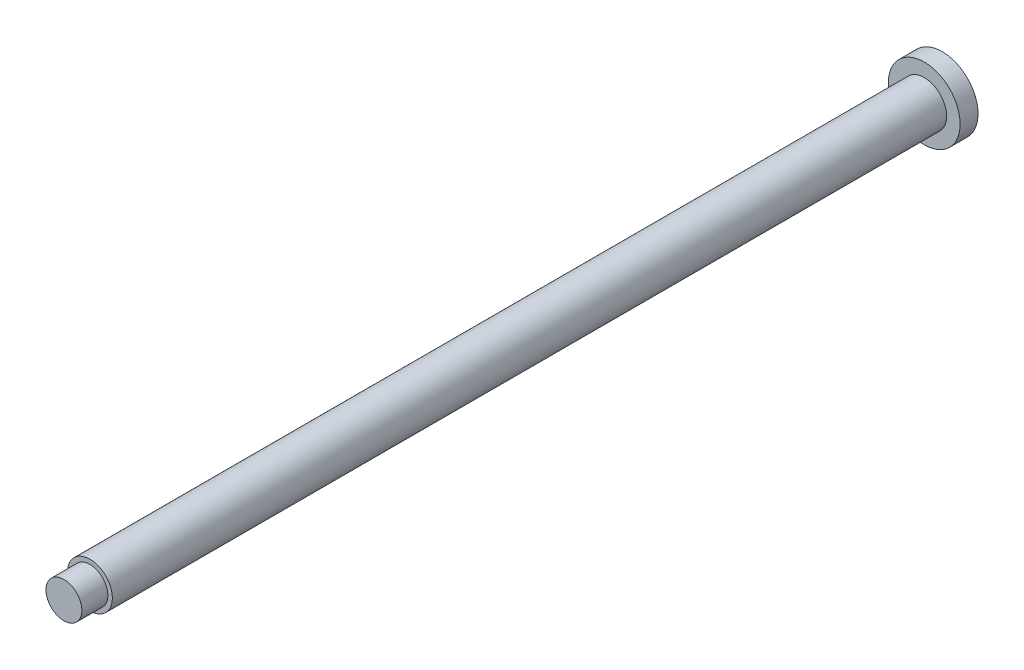
ISO-10303-21;
HEADER;
FILE_DESCRIPTION(('STEP AP214'),'2;1');
FILE_NAME('part.step','',(''),(''),'','','');
FILE_SCHEMA(('AUTOMOTIVE_DESIGN { 1 0 10303 214 1 1 1 1 }'));
ENDSEC;
DATA;
#1=APPLICATION_CONTEXT('core data for automotive mechanical design processes');
#2=APPLICATION_PROTOCOL_DEFINITION('international standard','automotive_design',2000,#1);
#3=PRODUCT_CONTEXT('',#1,'mechanical');
#4=PRODUCT('Part','Part','',(#3));
#5=PRODUCT_RELATED_PRODUCT_CATEGORY('part','',(#4));
#6=PRODUCT_DEFINITION_FORMATION('','',#4);
#7=PRODUCT_DEFINITION_CONTEXT('part definition',#1,'design');
#8=PRODUCT_DEFINITION('design','',#6,#7);
#9=PRODUCT_DEFINITION_SHAPE('','',#8);
#10=(LENGTH_UNIT() NAMED_UNIT(*) SI_UNIT(.MILLI.,.METRE.));
#11=(NAMED_UNIT(*) PLANE_ANGLE_UNIT() SI_UNIT($,.RADIAN.));
#12=(NAMED_UNIT(*) SI_UNIT($,.STERADIAN.) SOLID_ANGLE_UNIT());
#13=UNCERTAINTY_MEASURE_WITH_UNIT(LENGTH_MEASURE(1.E-05),#10,'distance_accuracy_value','');
#14=(GEOMETRIC_REPRESENTATION_CONTEXT(3) GLOBAL_UNCERTAINTY_ASSIGNED_CONTEXT((#13)) GLOBAL_UNIT_ASSIGNED_CONTEXT((#10,
#11,#12)) REPRESENTATION_CONTEXT('',''));
#15=CARTESIAN_POINT('',(0.,0.,0.));
#16=DIRECTION('',(0.,0.,1.));
#17=DIRECTION('',(1.,0.,0.));
#18=AXIS2_PLACEMENT_3D('',#15,#16,#17);
#19=CARTESIAN_POINT('',(0.,0.,93.));
#20=DIRECTION('',(0.,0.,-1.));
#21=DIRECTION('',(-1.,0.,0.));
#22=AXIS2_PLACEMENT_3D('',#19,#20,#21);
#23=CYLINDRICAL_SURFACE('',#22,2.5);
#24=CARTESIAN_POINT('',(0.,0.,93.));
#25=DIRECTION('',(0.,0.,1.));
#26=DIRECTION('',(1.,0.,0.));
#27=AXIS2_PLACEMENT_3D('',#24,#25,#26);
#28=CIRCLE('',#27,2.5);
#29=CARTESIAN_POINT('',(-2.5,0.,93.));
#30=VERTEX_POINT('',#29);
#31=EDGE_CURVE('E55',#30,#30,#28,.T.);
#32=CARTESIAN_POINT('',(0.,0.,0.));
#33=DIRECTION('',(0.,0.,1.));
#34=DIRECTION('',(1.,0.,0.));
#35=AXIS2_PLACEMENT_3D('',#32,#33,#34);
#36=CIRCLE('',#35,2.5);
#37=CARTESIAN_POINT('',(-2.5,0.,0.));
#38=VERTEX_POINT('',#37);
#39=EDGE_CURVE('E50',#38,#38,#36,.T.);
#40=CARTESIAN_POINT('',(-2.5,0.,93.));
#41=CARTESIAN_POINT('',(-2.5,0.,92.03125));
#42=CARTESIAN_POINT('',(-2.5,0.,91.0625));
#43=CARTESIAN_POINT('',(-2.5,0.,89.125));
#44=CARTESIAN_POINT('',(-2.5,0.,88.15625));
#45=CARTESIAN_POINT('',(-2.5,0.,86.21875));
#46=CARTESIAN_POINT('',(-2.5,0.,85.25));
#47=CARTESIAN_POINT('',(-2.5,0.,83.3125));
#48=CARTESIAN_POINT('',(-2.5,0.,82.34375));
#49=CARTESIAN_POINT('',(-2.5,0.,80.40625));
#50=CARTESIAN_POINT('',(-2.5,0.,79.4375));
#51=CARTESIAN_POINT('',(-2.5,0.,77.5));
#52=CARTESIAN_POINT('',(-2.5,0.,76.53125));
#53=CARTESIAN_POINT('',(-2.5,0.,74.59375));
#54=CARTESIAN_POINT('',(-2.5,0.,73.625));
#55=CARTESIAN_POINT('',(-2.5,0.,71.6875));
#56=CARTESIAN_POINT('',(-2.5,0.,70.71875));
#57=CARTESIAN_POINT('',(-2.5,0.,68.78125));
#58=CARTESIAN_POINT('',(-2.5,0.,67.8125));
#59=CARTESIAN_POINT('',(-2.5,0.,65.875));
#60=CARTESIAN_POINT('',(-2.5,0.,64.90625));
#61=CARTESIAN_POINT('',(-2.5,0.,62.96875));
#62=CARTESIAN_POINT('',(-2.5,0.,62.));
#63=CARTESIAN_POINT('',(-2.5,0.,60.0625));
#64=CARTESIAN_POINT('',(-2.5,0.,59.09375));
#65=CARTESIAN_POINT('',(-2.5,0.,57.15625));
#66=CARTESIAN_POINT('',(-2.5,0.,56.1875));
#67=CARTESIAN_POINT('',(-2.5,0.,54.25));
#68=CARTESIAN_POINT('',(-2.5,0.,53.28125));
#69=CARTESIAN_POINT('',(-2.5,0.,51.34375));
#70=CARTESIAN_POINT('',(-2.5,0.,50.375));
#71=CARTESIAN_POINT('',(-2.5,0.,48.4375));
#72=CARTESIAN_POINT('',(-2.5,0.,47.46875));
#73=CARTESIAN_POINT('',(-2.5,0.,45.53125));
#74=CARTESIAN_POINT('',(-2.5,0.,44.5625));
#75=CARTESIAN_POINT('',(-2.5,0.,42.625));
#76=CARTESIAN_POINT('',(-2.5,0.,41.65625));
#77=CARTESIAN_POINT('',(-2.5,0.,39.71875));
#78=CARTESIAN_POINT('',(-2.5,0.,38.75));
#79=CARTESIAN_POINT('',(-2.5,0.,36.8125));
#80=CARTESIAN_POINT('',(-2.5,0.,35.84375));
#81=CARTESIAN_POINT('',(-2.5,0.,33.90625));
#82=CARTESIAN_POINT('',(-2.5,0.,32.9375));
#83=CARTESIAN_POINT('',(-2.5,0.,31.));
#84=CARTESIAN_POINT('',(-2.5,0.,30.03125));
#85=CARTESIAN_POINT('',(-2.5,0.,28.09375));
#86=CARTESIAN_POINT('',(-2.5,0.,27.125));
#87=CARTESIAN_POINT('',(-2.5,0.,25.1875));
#88=CARTESIAN_POINT('',(-2.5,0.,24.21875));
#89=CARTESIAN_POINT('',(-2.5,0.,22.28125));
#90=CARTESIAN_POINT('',(-2.5,0.,21.3125));
#91=CARTESIAN_POINT('',(-2.5,0.,19.375));
#92=CARTESIAN_POINT('',(-2.5,0.,18.40625));
#93=CARTESIAN_POINT('',(-2.5,0.,16.46875));
#94=CARTESIAN_POINT('',(-2.5,0.,15.5));
#95=CARTESIAN_POINT('',(-2.5,0.,13.5625));
#96=CARTESIAN_POINT('',(-2.5,0.,12.59375));
#97=CARTESIAN_POINT('',(-2.5,0.,10.65625));
#98=CARTESIAN_POINT('',(-2.5,0.,9.68749999999998));
#99=CARTESIAN_POINT('',(-2.5,0.,7.74999999999998));
#100=CARTESIAN_POINT('',(-2.5,0.,6.78124999999998));
#101=CARTESIAN_POINT('',(-2.5,0.,4.84374999999998));
#102=CARTESIAN_POINT('',(-2.5,0.,3.87499999999999));
#103=CARTESIAN_POINT('',(-2.5,0.,1.93749999999999));
#104=CARTESIAN_POINT('',(-2.5,0.,0.968749999999985));
#105=CARTESIAN_POINT('',(-2.5,0.,0.));
#106=B_SPLINE_CURVE_WITH_KNOTS('',3,(#40,#41,#42,#43,#44,#45,#46,#47,#48,#49,#50,#51,#52,#53,
#54,#55,#56,#57,#58,#59,#60,#61,#62,#63,#64,#65,#66,#67,#68,#69,#70,#71,#72,#73,#74,#75,#76,#77,
#78,#79,#80,#81,#82,#83,#84,#85,#86,#87,#88,#89,#90,#91,#92,#93,#94,#95,#96,#97,#98,#99,#100,
#101,#102,#103,#104,#105),.UNSPECIFIED.,.F.,.F.,(4,2,2,2,2,2,2,2,2,2,2,2,2,2,2,2,2,2,2,2,2,2,2,
2,2,2,2,2,2,2,2,2,4),(0.,2.90625000000001,5.81250000000001,8.71875000000001,11.625,14.53125,
17.4375,20.34375,23.25,26.15625,29.0625,31.96875,34.875,37.78125,40.6875,43.59375,46.5,49.40625,
52.3125,55.21875,58.125,61.03125,63.9375,66.84375,69.75,72.65625,75.5625,78.46875,81.375,
84.28125,87.1875,90.09375,93.),.UNSPECIFIED.);
#107=EDGE_CURVE('BSEAM47',#30,#38,#106,.T.);
#108=ORIENTED_EDGE('',*,*,#31,.F.);
#109=ORIENTED_EDGE('',*,*,#39,.T.);
#110=ORIENTED_EDGE('',*,*,#107,.T.);
#111=ORIENTED_EDGE('',*,*,#107,.F.);
#112=EDGE_LOOP('',(#108,#110,#109,#111));
#113=FACE_BOUND('',#112,.T.);
#114=ADVANCED_FACE('F47',(#113),#23,.T.);
#115=CARTESIAN_POINT('',(0.,0.,93.));
#116=DIRECTION('',(0.,0.,1.));
#117=DIRECTION('',(1.,0.,0.));
#118=AXIS2_PLACEMENT_3D('',#115,#116,#117);
#119=PLANE('',#118);
#120=CARTESIAN_POINT('',(0.,0.,93.));
#121=DIRECTION('',(0.,0.,1.));
#122=DIRECTION('',(1.,0.,0.));
#123=AXIS2_PLACEMENT_3D('',#120,#121,#122);
#124=CIRCLE('',#123,2.);
#125=CARTESIAN_POINT('',(2.,0.,93.));
#126=VERTEX_POINT('',#125);
#127=EDGE_CURVE('E10',#126,#126,#124,.T.);
#128=ORIENTED_EDGE('',*,*,#127,.F.);
#129=EDGE_LOOP('',(#128));
#130=FACE_BOUND('',#129,.T.);
#131=ORIENTED_EDGE('',*,*,#31,.T.);
#132=EDGE_LOOP('',(#131));
#133=FACE_BOUND('',#132,.T.);
#134=ADVANCED_FACE('F102',(#130,#133),#119,.T.);
#135=CARTESIAN_POINT('',(0.,0.,-2.));
#136=DIRECTION('',(0.,0.,1.));
#137=DIRECTION('',(1.,0.,0.));
#138=AXIS2_PLACEMENT_3D('',#135,#136,#137);
#139=CYLINDRICAL_SURFACE('',#138,4.);
#140=CARTESIAN_POINT('',(0.,0.,-2.));
#141=DIRECTION('',(0.,0.,-1.));
#142=DIRECTION('',(-1.,0.,0.));
#143=AXIS2_PLACEMENT_3D('',#140,#141,#142);
#144=CIRCLE('',#143,4.);
#145=CARTESIAN_POINT('',(-4.,0.,-2.));
#146=VERTEX_POINT('',#145);
#147=EDGE_CURVE('E73',#146,#146,#144,.T.);
#148=ORIENTED_EDGE('',*,*,#147,.F.);
#149=EDGE_LOOP('',(#148));
#150=FACE_BOUND('',#149,.T.);
#151=CARTESIAN_POINT('',(0.,0.,0.));
#152=DIRECTION('',(0.,0.,-1.));
#153=DIRECTION('',(-1.,0.,0.));
#154=AXIS2_PLACEMENT_3D('',#151,#152,#153);
#155=CIRCLE('',#154,4.);
#156=CARTESIAN_POINT('',(-4.,0.,0.));
#157=VERTEX_POINT('',#156);
#158=EDGE_CURVE('E68',#157,#157,#155,.T.);
#159=ORIENTED_EDGE('',*,*,#158,.T.);
#160=EDGE_LOOP('',(#159));
#161=FACE_BOUND('',#160,.T.);
#162=ADVANCED_FACE('F81',(#150,#161),#139,.T.);
#163=CARTESIAN_POINT('',(0.,0.,-2.));
#164=DIRECTION('',(0.,0.,-1.));
#165=DIRECTION('',(-1.,0.,0.));
#166=AXIS2_PLACEMENT_3D('',#163,#164,#165);
#167=PLANE('',#166);
#168=CARTESIAN_POINT('',(0.,0.,-2.));
#169=DIRECTION('',(0.,0.,-1.));
#170=DIRECTION('',(-1.,0.,0.));
#171=AXIS2_PLACEMENT_3D('',#168,#169,#170);
#172=CIRCLE('',#171,2.05);
#173=CARTESIAN_POINT('',(-2.05,0.,-2.));
#174=VERTEX_POINT('',#173);
#175=EDGE_CURVE('E69',#174,#174,#172,.T.);
#176=ORIENTED_EDGE('',*,*,#175,.F.);
#177=EDGE_LOOP('',(#176));
#178=FACE_BOUND('',#177,.T.);
#179=ORIENTED_EDGE('',*,*,#147,.T.);
#180=EDGE_LOOP('',(#179));
#181=FACE_BOUND('',#180,.T.);
#182=ADVANCED_FACE('F86',(#178,#181),#167,.T.);
#183=CARTESIAN_POINT('',(0.,0.,0.));
#184=DIRECTION('',(0.,0.,-1.));
#185=DIRECTION('',(-1.,0.,0.));
#186=AXIS2_PLACEMENT_3D('',#183,#184,#185);
#187=PLANE('',#186);
#188=ORIENTED_EDGE('',*,*,#39,.F.);
#189=EDGE_LOOP('',(#188));
#190=FACE_BOUND('',#189,.T.);
#191=ORIENTED_EDGE('',*,*,#158,.F.);
#192=EDGE_LOOP('',(#191));
#193=FACE_BOUND('',#192,.T.);
#194=ADVANCED_FACE('F83',(#190,#193),#187,.F.);
#195=CARTESIAN_POINT('',(0.,0.,1.));
#196=DIRECTION('',(0.,0.,-1.));
#197=DIRECTION('',(-1.,0.,0.));
#198=AXIS2_PLACEMENT_3D('',#195,#196,#197);
#199=CYLINDRICAL_SURFACE('',#198,2.05);
#200=CARTESIAN_POINT('',(0.,0.,1.));
#201=DIRECTION('',(0.,0.,-1.));
#202=DIRECTION('',(-1.,0.,0.));
#203=AXIS2_PLACEMENT_3D('',#200,#201,#202);
#204=CIRCLE('',#203,2.05);
#205=CARTESIAN_POINT('',(-2.05,0.,1.));
#206=VERTEX_POINT('',#205);
#207=EDGE_CURVE('E64',#206,#206,#204,.T.);
#208=ORIENTED_EDGE('',*,*,#207,.F.);
#209=EDGE_LOOP('',(#208));
#210=FACE_BOUND('',#209,.T.);
#211=ORIENTED_EDGE('',*,*,#175,.T.);
#212=EDGE_LOOP('',(#211));
#213=FACE_BOUND('',#212,.T.);
#214=ADVANCED_FACE('F85',(#210,#213),#199,.F.);
#215=CARTESIAN_POINT('',(0.,0.,1.));
#216=DIRECTION('',(0.,0.,-1.));
#217=DIRECTION('',(-1.,0.,0.));
#218=AXIS2_PLACEMENT_3D('',#215,#216,#217);
#219=PLANE('',#218);
#220=ORIENTED_EDGE('',*,*,#207,.T.);
#221=EDGE_LOOP('',(#220));
#222=FACE_BOUND('',#221,.T.);
#223=ADVANCED_FACE('F94',(#222),#219,.T.);
#224=CARTESIAN_POINT('',(0.,0.,95.9));
#225=DIRECTION('',(0.,0.,-1.));
#226=DIRECTION('',(-1.,0.,0.));
#227=AXIS2_PLACEMENT_3D('',#224,#225,#226);
#228=CYLINDRICAL_SURFACE('',#227,2.);
#229=CARTESIAN_POINT('',(0.,0.,95.9));
#230=DIRECTION('',(0.,0.,1.));
#231=DIRECTION('',(1.,0.,0.));
#232=AXIS2_PLACEMENT_3D('',#229,#230,#231);
#233=CIRCLE('',#232,2.);
#234=CARTESIAN_POINT('',(2.,0.,95.9));
#235=VERTEX_POINT('',#234);
#236=EDGE_CURVE('E63',#235,#235,#233,.T.);
#237=ORIENTED_EDGE('',*,*,#236,.F.);
#238=EDGE_LOOP('',(#237));
#239=FACE_BOUND('',#238,.T.);
#240=ORIENTED_EDGE('',*,*,#127,.T.);
#241=EDGE_LOOP('',(#240));
#242=FACE_BOUND('',#241,.T.);
#243=ADVANCED_FACE('F138',(#239,#242),#228,.T.);
#244=CARTESIAN_POINT('',(0.,0.,95.9));
#245=DIRECTION('',(0.,0.,1.));
#246=DIRECTION('',(1.,0.,0.));
#247=AXIS2_PLACEMENT_3D('',#244,#245,#246);
#248=PLANE('',#247);
#249=ORIENTED_EDGE('',*,*,#236,.T.);
#250=EDGE_LOOP('',(#249));
#251=FACE_BOUND('',#250,.T.);
#252=ADVANCED_FACE('F142',(#251),#248,.T.);
#253=CLOSED_SHELL('',(#114,#134,#162,#182,#194,#214,#223,#243,#252));
#254=MANIFOLD_SOLID_BREP('B2',#253);
#255=ADVANCED_BREP_SHAPE_REPRESENTATION('',(#18,#254),#14);
#256=SHAPE_DEFINITION_REPRESENTATION(#9,#255);
ENDSEC;
END-ISO-10303-21;
